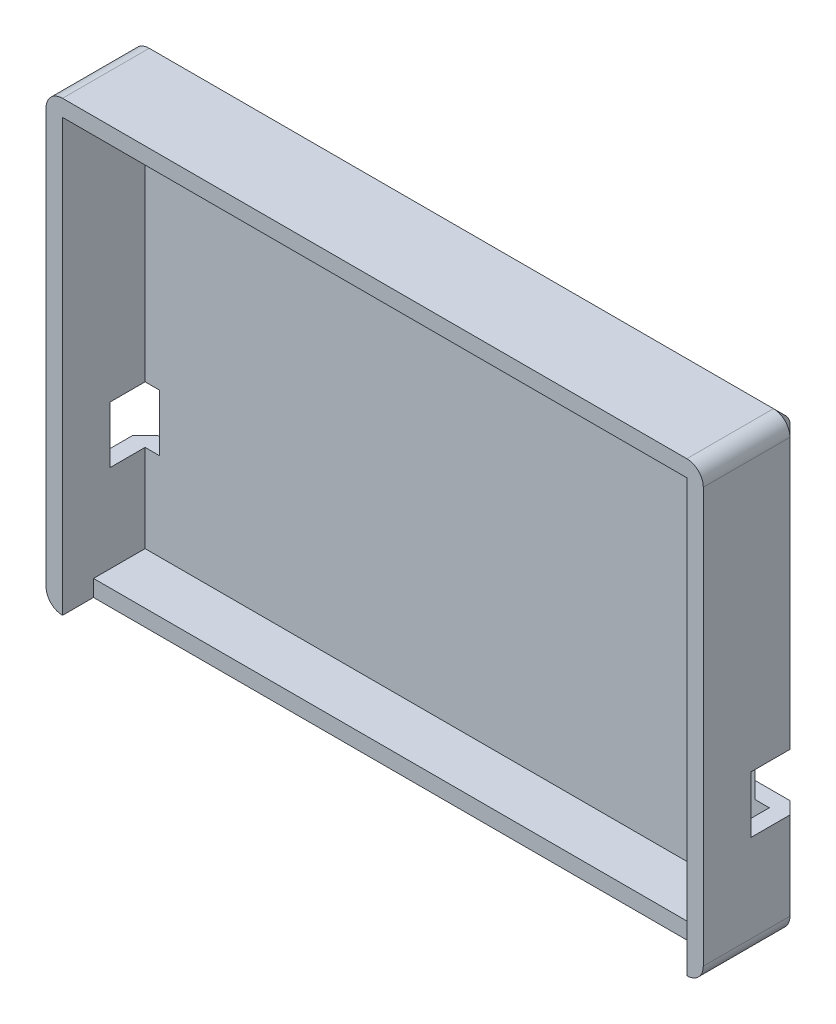
ISO-10303-21;
HEADER;
FILE_DESCRIPTION(('STEP AP214'),'2;1');
FILE_NAME('part.step','',(''),(''),'','','');
FILE_SCHEMA(('AUTOMOTIVE_DESIGN { 1 0 10303 214 1 1 1 1 }'));
ENDSEC;
DATA;
#1=APPLICATION_CONTEXT('core data for automotive mechanical design processes');
#2=APPLICATION_PROTOCOL_DEFINITION('international standard','automotive_design',2000,#1);
#3=PRODUCT_CONTEXT('',#1,'mechanical');
#4=PRODUCT('Part','Part','',(#3));
#5=PRODUCT_RELATED_PRODUCT_CATEGORY('part','',(#4));
#6=PRODUCT_DEFINITION_FORMATION('','',#4);
#7=PRODUCT_DEFINITION_CONTEXT('part definition',#1,'design');
#8=PRODUCT_DEFINITION('design','',#6,#7);
#9=PRODUCT_DEFINITION_SHAPE('','',#8);
#10=(LENGTH_UNIT() NAMED_UNIT(*) SI_UNIT(.MILLI.,.METRE.));
#11=(NAMED_UNIT(*) PLANE_ANGLE_UNIT() SI_UNIT($,.RADIAN.));
#12=(NAMED_UNIT(*) SI_UNIT($,.STERADIAN.) SOLID_ANGLE_UNIT());
#13=UNCERTAINTY_MEASURE_WITH_UNIT(LENGTH_MEASURE(1.E-05),#10,'distance_accuracy_value','');
#14=(GEOMETRIC_REPRESENTATION_CONTEXT(3) GLOBAL_UNCERTAINTY_ASSIGNED_CONTEXT((#13)) GLOBAL_UNIT_ASSIGNED_CONTEXT((#10,
#11,#12)) REPRESENTATION_CONTEXT('',''));
#15=CARTESIAN_POINT('',(0.,0.,0.));
#16=DIRECTION('',(0.,0.,1.));
#17=DIRECTION('',(1.,0.,0.));
#18=AXIS2_PLACEMENT_3D('',#15,#16,#17);
#19=CARTESIAN_POINT('',(-31.85,-21.7,1.6));
#20=DIRECTION('',(0.,1.,0.));
#21=DIRECTION('',(0.,0.,1.));
#22=AXIS2_PLACEMENT_3D('',#19,#20,#21);
#23=PLANE('',#22);
#24=DIRECTION('',(0.,0.,-1.));
#25=VECTOR('',#24,1.);
#26=CARTESIAN_POINT('',(-30.25,-21.7,1.6));
#27=LINE('',#26,#25);
#28=CARTESIAN_POINT('',(-30.25,-21.7,6.6));
#29=VERTEX_POINT('',#28);
#30=CARTESIAN_POINT('',(-30.25,-21.7,1.2));
#31=VERTEX_POINT('',#30);
#32=EDGE_CURVE('E413',#29,#31,#27,.T.);
#33=ORIENTED_EDGE('',*,*,#32,.T.);
#34=DIRECTION('',(1.,0.,0.));
#35=VECTOR('',#34,1.);
#36=CARTESIAN_POINT('',(-31.85,-21.7,1.2));
#37=LINE('',#36,#35);
#38=CARTESIAN_POINT('',(30.25,-21.7,1.2));
#39=VERTEX_POINT('',#38);
#40=EDGE_CURVE('E457',#31,#39,#37,.T.);
#41=ORIENTED_EDGE('',*,*,#40,.T.);
#42=DIRECTION('',(0.,0.,-1.));
#43=VECTOR('',#42,1.);
#44=CARTESIAN_POINT('',(30.25,-21.7,1.6));
#45=LINE('',#44,#43);
#46=CARTESIAN_POINT('',(30.25,-21.7,6.6));
#47=VERTEX_POINT('',#46);
#48=EDGE_CURVE('E411',#39,#47,#45,.F.);
#49=ORIENTED_EDGE('',*,*,#48,.T.);
#50=DIRECTION('',(-1.,0.,0.));
#51=VECTOR('',#50,1.);
#52=CARTESIAN_POINT('',(-30.25,-21.7,6.6));
#53=LINE('',#52,#51);
#54=EDGE_CURVE('E308',#47,#29,#53,.T.);
#55=ORIENTED_EDGE('',*,*,#54,.T.);
#56=EDGE_LOOP('',(#33,#41,#49,#55));
#57=FACE_BOUND('',#56,.T.);
#58=ADVANCED_FACE('F33',(#57),#23,.F.);
#59=CARTESIAN_POINT('',(31.85,-21.7,1.6));
#60=DIRECTION('',(-1.,0.,0.));
#61=DIRECTION('',(0.,0.,1.));
#62=AXIS2_PLACEMENT_3D('',#59,#60,#61);
#63=PLANE('',#62);
#64=DIRECTION('',(0.,0.,-1.));
#65=VECTOR('',#64,1.);
#66=CARTESIAN_POINT('',(31.85,-20.1,1.6));
#67=LINE('',#66,#65);
#68=CARTESIAN_POINT('',(31.85,-20.1,9.6));
#69=VERTEX_POINT('',#68);
#70=CARTESIAN_POINT('',(31.85,-20.1,1.2));
#71=VERTEX_POINT('',#70);
#72=EDGE_CURVE('E418',#69,#71,#67,.T.);
#73=ORIENTED_EDGE('',*,*,#72,.T.);
#74=DIRECTION('',(0.,1.,0.));
#75=VECTOR('',#74,1.);
#76=CARTESIAN_POINT('',(31.85,-21.7,1.2));
#77=LINE('',#76,#75);
#78=CARTESIAN_POINT('',(31.85,-11.6,1.2));
#79=VERTEX_POINT('',#78);
#80=EDGE_CURVE('E449',#71,#79,#77,.T.);
#81=ORIENTED_EDGE('',*,*,#80,.T.);
#82=DIRECTION('',(0.,0.,-1.));
#83=VECTOR('',#82,1.);
#84=CARTESIAN_POINT('',(31.85,-11.6,5.));
#85=LINE('',#84,#83);
#86=CARTESIAN_POINT('',(31.85,-11.6,5.));
#87=VERTEX_POINT('',#86);
#88=EDGE_CURVE('E259',#87,#79,#85,.T.);
#89=ORIENTED_EDGE('',*,*,#88,.F.);
#90=DIRECTION('',(0.,-1.,0.));
#91=VECTOR('',#90,1.);
#92=CARTESIAN_POINT('',(31.85,-6.1,5.));
#93=LINE('',#92,#91);
#94=CARTESIAN_POINT('',(31.85,-6.1,5.));
#95=VERTEX_POINT('',#94);
#96=EDGE_CURVE('E242',#95,#87,#93,.T.);
#97=ORIENTED_EDGE('',*,*,#96,.F.);
#98=DIRECTION('',(0.,0.,-1.));
#99=VECTOR('',#98,1.);
#100=CARTESIAN_POINT('',(31.85,-6.1,5.));
#101=LINE('',#100,#99);
#102=CARTESIAN_POINT('',(31.85,-6.1,1.2));
#103=VERTEX_POINT('',#102);
#104=EDGE_CURVE('E251',#95,#103,#101,.T.);
#105=ORIENTED_EDGE('',*,*,#104,.T.);
#106=DIRECTION('',(0.,1.,0.));
#107=VECTOR('',#106,1.);
#108=CARTESIAN_POINT('',(31.85,-21.7,1.2));
#109=LINE('',#108,#107);
#110=CARTESIAN_POINT('',(31.85,20.1,1.2));
#111=VERTEX_POINT('',#110);
#112=EDGE_CURVE('E447',#103,#111,#109,.T.);
#113=ORIENTED_EDGE('',*,*,#112,.T.);
#114=DIRECTION('',(0.,0.,-1.));
#115=VECTOR('',#114,1.);
#116=CARTESIAN_POINT('',(31.85,20.1,1.6));
#117=LINE('',#116,#115);
#118=CARTESIAN_POINT('',(31.85,20.1,9.6));
#119=VERTEX_POINT('',#118);
#120=EDGE_CURVE('E416',#111,#119,#117,.F.);
#121=ORIENTED_EDGE('',*,*,#120,.T.);
#122=DIRECTION('',(0.,1.,0.));
#123=VECTOR('',#122,1.);
#124=CARTESIAN_POINT('',(31.85,-21.7,9.6));
#125=LINE('',#124,#123);
#126=EDGE_CURVE('E352',#69,#119,#125,.T.);
#127=ORIENTED_EDGE('',*,*,#126,.F.);
#128=EDGE_LOOP('',(#73,#81,#89,#97,#105,#113,#121,#127));
#129=FACE_BOUND('',#128,.T.);
#130=ADVANCED_FACE('F264',(#129),#63,.F.);
#131=CARTESIAN_POINT('',(-31.85,21.7,1.6));
#132=DIRECTION('',(0.,-1.,0.));
#133=DIRECTION('',(1.,0.,0.));
#134=AXIS2_PLACEMENT_3D('',#131,#132,#133);
#135=PLANE('',#134);
#136=DIRECTION('',(0.,0.,-1.));
#137=VECTOR('',#136,1.);
#138=CARTESIAN_POINT('',(30.25,21.7,1.6));
#139=LINE('',#138,#137);
#140=CARTESIAN_POINT('',(30.25,21.7,9.6));
#141=VERTEX_POINT('',#140);
#142=CARTESIAN_POINT('',(30.25,21.7,1.2));
#143=VERTEX_POINT('',#142);
#144=EDGE_CURVE('E399',#141,#143,#139,.T.);
#145=ORIENTED_EDGE('',*,*,#144,.T.);
#146=DIRECTION('',(-1.,0.,0.));
#147=VECTOR('',#146,1.);
#148=CARTESIAN_POINT('',(-31.85,21.7,1.2));
#149=LINE('',#148,#147);
#150=CARTESIAN_POINT('',(-30.25,21.7,1.2));
#151=VERTEX_POINT('',#150);
#152=EDGE_CURVE('E11',#143,#151,#149,.T.);
#153=ORIENTED_EDGE('',*,*,#152,.T.);
#154=DIRECTION('',(0.,0.,-1.));
#155=VECTOR('',#154,1.);
#156=CARTESIAN_POINT('',(-30.25,21.7,1.6));
#157=LINE('',#156,#155);
#158=CARTESIAN_POINT('',(-30.25,21.7,9.6));
#159=VERTEX_POINT('',#158);
#160=EDGE_CURVE('E401',#151,#159,#157,.F.);
#161=ORIENTED_EDGE('',*,*,#160,.T.);
#162=DIRECTION('',(-1.,0.,0.));
#163=VECTOR('',#162,1.);
#164=CARTESIAN_POINT('',(31.85,21.7,9.6));
#165=LINE('',#164,#163);
#166=EDGE_CURVE('E355',#141,#159,#165,.T.);
#167=ORIENTED_EDGE('',*,*,#166,.F.);
#168=EDGE_LOOP('',(#145,#153,#161,#167));
#169=FACE_BOUND('',#168,.T.);
#170=ADVANCED_FACE('F599',(#169),#135,.F.);
#171=CARTESIAN_POINT('',(-31.85,-21.7,1.6));
#172=DIRECTION('',(1.,0.,0.));
#173=DIRECTION('',(0.,0.,-1.));
#174=AXIS2_PLACEMENT_3D('',#171,#172,#173);
#175=PLANE('',#174);
#176=DIRECTION('',(0.,0.,-1.));
#177=VECTOR('',#176,1.);
#178=CARTESIAN_POINT('',(-31.85,-11.6,5.));
#179=LINE('',#178,#177);
#180=CARTESIAN_POINT('',(-31.85,-11.6,5.));
#181=VERTEX_POINT('',#180);
#182=CARTESIAN_POINT('',(-31.85,-11.6,1.2));
#183=VERTEX_POINT('',#182);
#184=EDGE_CURVE('E284',#181,#183,#179,.T.);
#185=ORIENTED_EDGE('',*,*,#184,.T.);
#186=DIRECTION('',(0.,-1.,0.));
#187=VECTOR('',#186,1.);
#188=CARTESIAN_POINT('',(-31.85,-21.7,1.2));
#189=LINE('',#188,#187);
#190=CARTESIAN_POINT('',(-31.85,-20.1,1.2));
#191=VERTEX_POINT('',#190);
#192=EDGE_CURVE('E422',#183,#191,#189,.T.);
#193=ORIENTED_EDGE('',*,*,#192,.T.);
#194=DIRECTION('',(0.,0.,-1.));
#195=VECTOR('',#194,1.);
#196=CARTESIAN_POINT('',(-31.85,-20.1,1.6));
#197=LINE('',#196,#195);
#198=CARTESIAN_POINT('',(-31.85,-20.1,9.6));
#199=VERTEX_POINT('',#198);
#200=EDGE_CURVE('E394',#191,#199,#197,.F.);
#201=ORIENTED_EDGE('',*,*,#200,.T.);
#202=DIRECTION('',(0.,-1.,0.));
#203=VECTOR('',#202,1.);
#204=CARTESIAN_POINT('',(-31.85,-21.7,9.6));
#205=LINE('',#204,#203);
#206=CARTESIAN_POINT('',(-31.85,20.1,9.6));
#207=VERTEX_POINT('',#206);
#208=EDGE_CURVE('E349',#207,#199,#205,.T.);
#209=ORIENTED_EDGE('',*,*,#208,.F.);
#210=DIRECTION('',(0.,0.,-1.));
#211=VECTOR('',#210,1.);
#212=CARTESIAN_POINT('',(-31.85,20.1,1.6));
#213=LINE('',#212,#211);
#214=CARTESIAN_POINT('',(-31.85,20.1,1.2));
#215=VERTEX_POINT('',#214);
#216=EDGE_CURVE('E396',#207,#215,#213,.T.);
#217=ORIENTED_EDGE('',*,*,#216,.T.);
#218=DIRECTION('',(0.,-1.,0.));
#219=VECTOR('',#218,1.);
#220=CARTESIAN_POINT('',(-31.85,-21.7,1.2));
#221=LINE('',#220,#219);
#222=CARTESIAN_POINT('',(-31.85,-6.1,1.2));
#223=VERTEX_POINT('',#222);
#224=EDGE_CURVE('E420',#215,#223,#221,.T.);
#225=ORIENTED_EDGE('',*,*,#224,.T.);
#226=DIRECTION('',(0.,0.,-1.));
#227=VECTOR('',#226,1.);
#228=CARTESIAN_POINT('',(-31.85,-6.1,5.));
#229=LINE('',#228,#227);
#230=CARTESIAN_POINT('',(-31.85,-6.1,5.));
#231=VERTEX_POINT('',#230);
#232=EDGE_CURVE('E271',#231,#223,#229,.T.);
#233=ORIENTED_EDGE('',*,*,#232,.F.);
#234=DIRECTION('',(0.,1.,0.));
#235=VECTOR('',#234,1.);
#236=CARTESIAN_POINT('',(-31.85,-6.1,5.));
#237=LINE('',#236,#235);
#238=EDGE_CURVE('E281',#181,#231,#237,.T.);
#239=ORIENTED_EDGE('',*,*,#238,.F.);
#240=EDGE_LOOP('',(#185,#193,#201,#209,#217,#225,#233,#239));
#241=FACE_BOUND('',#240,.T.);
#242=ADVANCED_FACE('F495',(#241),#175,.F.);
#243=CARTESIAN_POINT('',(0.,0.,0.));
#244=DIRECTION('',(0.,0.,1.));
#245=DIRECTION('',(1.,0.,0.));
#246=AXIS2_PLACEMENT_3D('',#243,#244,#245);
#247=PLANE('',#246);
#248=CARTESIAN_POINT('',(-30.25,-20.1,0.));
#249=DIRECTION('',(0.,0.,1.));
#250=DIRECTION('',(1.,0.,0.));
#251=AXIS2_PLACEMENT_3D('',#248,#249,#250);
#252=CIRCLE('',#251,0.400000000000001);
#253=CARTESIAN_POINT('',(-30.25,-20.5,0.));
#254=VERTEX_POINT('',#253);
#255=CARTESIAN_POINT('',(-30.65,-20.1,0.));
#256=VERTEX_POINT('',#255);
#257=EDGE_CURVE('E439',#254,#256,#252,.F.);
#258=ORIENTED_EDGE('',*,*,#257,.T.);
#259=DIRECTION('',(0.,1.,0.));
#260=VECTOR('',#259,1.);
#261=CARTESIAN_POINT('',(-30.65,0.,0.));
#262=LINE('',#261,#260);
#263=CARTESIAN_POINT('',(-30.65,-11.6,0.));
#264=VERTEX_POINT('',#263);
#265=EDGE_CURVE('E443',#256,#264,#262,.T.);
#266=ORIENTED_EDGE('',*,*,#265,.T.);
#267=DIRECTION('',(-1.,0.,0.));
#268=VECTOR('',#267,1.);
#269=CARTESIAN_POINT('',(-31.85,-11.6,0.));
#270=LINE('',#269,#268);
#271=CARTESIAN_POINT('',(-27.25,-11.6,0.));
#272=VERTEX_POINT('',#271);
#273=EDGE_CURVE('E279',#272,#264,#270,.T.);
#274=ORIENTED_EDGE('',*,*,#273,.F.);
#275=DIRECTION('',(0.,1.,0.));
#276=VECTOR('',#275,1.);
#277=CARTESIAN_POINT('',(-27.25,0.,0.));
#278=LINE('',#277,#276);
#279=CARTESIAN_POINT('',(-27.25,-6.1,0.));
#280=VERTEX_POINT('',#279);
#281=EDGE_CURVE('E379',#272,#280,#278,.T.);
#282=ORIENTED_EDGE('',*,*,#281,.T.);
#283=DIRECTION('',(1.,0.,0.));
#284=VECTOR('',#283,1.);
#285=CARTESIAN_POINT('',(-31.85,-6.1,0.));
#286=LINE('',#285,#284);
#287=CARTESIAN_POINT('',(-30.65,-6.1,0.));
#288=VERTEX_POINT('',#287);
#289=EDGE_CURVE('E285',#288,#280,#286,.T.);
#290=ORIENTED_EDGE('',*,*,#289,.F.);
#291=DIRECTION('',(0.,1.,0.));
#292=VECTOR('',#291,1.);
#293=CARTESIAN_POINT('',(-30.65,0.,0.));
#294=LINE('',#293,#292);
#295=CARTESIAN_POINT('',(-30.65,20.1,0.));
#296=VERTEX_POINT('',#295);
#297=EDGE_CURVE('E431',#288,#296,#294,.T.);
#298=ORIENTED_EDGE('',*,*,#297,.T.);
#299=CARTESIAN_POINT('',(-30.25,20.1,0.));
#300=DIRECTION('',(0.,0.,1.));
#301=DIRECTION('',(1.,0.,0.));
#302=AXIS2_PLACEMENT_3D('',#299,#300,#301);
#303=CIRCLE('',#302,0.400000000000001);
#304=CARTESIAN_POINT('',(-30.25,20.5,0.));
#305=VERTEX_POINT('',#304);
#306=EDGE_CURVE('E427',#296,#305,#303,.F.);
#307=ORIENTED_EDGE('',*,*,#306,.T.);
#308=DIRECTION('',(1.,0.,0.));
#309=VECTOR('',#308,1.);
#310=CARTESIAN_POINT('',(0.,20.5,0.));
#311=LINE('',#310,#309);
#312=CARTESIAN_POINT('',(30.25,20.5,0.));
#313=VERTEX_POINT('',#312);
#314=EDGE_CURVE('E425',#305,#313,#311,.T.);
#315=ORIENTED_EDGE('',*,*,#314,.T.);
#316=CARTESIAN_POINT('',(30.25,20.1,0.));
#317=DIRECTION('',(0.,0.,1.));
#318=DIRECTION('',(1.,0.,0.));
#319=AXIS2_PLACEMENT_3D('',#316,#317,#318);
#320=CIRCLE('',#319,0.400000000000001);
#321=CARTESIAN_POINT('',(30.65,20.1,0.));
#322=VERTEX_POINT('',#321);
#323=EDGE_CURVE('E429',#313,#322,#320,.F.);
#324=ORIENTED_EDGE('',*,*,#323,.T.);
#325=DIRECTION('',(0.,-1.,0.));
#326=VECTOR('',#325,1.);
#327=CARTESIAN_POINT('',(30.65,0.,0.));
#328=LINE('',#327,#326);
#329=CARTESIAN_POINT('',(30.65,-6.1,0.));
#330=VERTEX_POINT('',#329);
#331=EDGE_CURVE('E433',#322,#330,#328,.T.);
#332=ORIENTED_EDGE('',*,*,#331,.T.);
#333=DIRECTION('',(1.,0.,0.));
#334=VECTOR('',#333,1.);
#335=CARTESIAN_POINT('',(31.85,-6.1,0.));
#336=LINE('',#335,#334);
#337=CARTESIAN_POINT('',(27.25,-6.1,0.));
#338=VERTEX_POINT('',#337);
#339=EDGE_CURVE('E269',#338,#330,#336,.T.);
#340=ORIENTED_EDGE('',*,*,#339,.F.);
#341=DIRECTION('',(0.,-1.,0.));
#342=VECTOR('',#341,1.);
#343=CARTESIAN_POINT('',(27.25,0.,0.));
#344=LINE('',#343,#342);
#345=CARTESIAN_POINT('',(27.25,-11.6,0.));
#346=VERTEX_POINT('',#345);
#347=EDGE_CURVE('E376',#338,#346,#344,.T.);
#348=ORIENTED_EDGE('',*,*,#347,.T.);
#349=DIRECTION('',(-1.,0.,0.));
#350=VECTOR('',#349,1.);
#351=CARTESIAN_POINT('',(31.85,-11.6,0.));
#352=LINE('',#351,#350);
#353=CARTESIAN_POINT('',(30.65,-11.6,0.));
#354=VERTEX_POINT('',#353);
#355=EDGE_CURVE('E248',#354,#346,#352,.T.);
#356=ORIENTED_EDGE('',*,*,#355,.F.);
#357=DIRECTION('',(0.,-1.,0.));
#358=VECTOR('',#357,1.);
#359=CARTESIAN_POINT('',(30.65,0.,0.));
#360=LINE('',#359,#358);
#361=CARTESIAN_POINT('',(30.65,-20.1,0.));
#362=VERTEX_POINT('',#361);
#363=EDGE_CURVE('E441',#354,#362,#360,.T.);
#364=ORIENTED_EDGE('',*,*,#363,.T.);
#365=CARTESIAN_POINT('',(30.25,-20.1,0.));
#366=DIRECTION('',(0.,0.,1.));
#367=DIRECTION('',(1.,0.,0.));
#368=AXIS2_PLACEMENT_3D('',#365,#366,#367);
#369=CIRCLE('',#368,0.400000000000001);
#370=CARTESIAN_POINT('',(30.25,-20.5,0.));
#371=VERTEX_POINT('',#370);
#372=EDGE_CURVE('E437',#362,#371,#369,.F.);
#373=ORIENTED_EDGE('',*,*,#372,.T.);
#374=DIRECTION('',(-1.,0.,0.));
#375=VECTOR('',#374,1.);
#376=CARTESIAN_POINT('',(0.,-20.5,0.));
#377=LINE('',#376,#375);
#378=EDGE_CURVE('E435',#371,#254,#377,.T.);
#379=ORIENTED_EDGE('',*,*,#378,.T.);
#380=EDGE_LOOP('',(#258,#266,#274,#282,#290,#298,#307,#315,#324,#332,#340,#348,#356,#364,#373,#379));
#381=FACE_BOUND('',#380,.T.);
#382=ADVANCED_FACE('F552',(#381),#247,.F.);
#383=CARTESIAN_POINT('',(0.,0.,9.6));
#384=DIRECTION('',(0.,0.,1.));
#385=DIRECTION('',(1.,0.,0.));
#386=AXIS2_PLACEMENT_3D('',#383,#384,#385);
#387=PLANE('',#386);
#388=ORIENTED_EDGE('',*,*,#166,.T.);
#389=CARTESIAN_POINT('',(-30.25,20.1,9.6));
#390=DIRECTION('',(0.,0.,1.));
#391=DIRECTION('',(1.,0.,0.));
#392=AXIS2_PLACEMENT_3D('',#389,#390,#391);
#393=CIRCLE('',#392,1.6);
#394=EDGE_CURVE('E409',#159,#207,#393,.T.);
#395=ORIENTED_EDGE('',*,*,#394,.T.);
#396=ORIENTED_EDGE('',*,*,#208,.T.);
#397=CARTESIAN_POINT('',(-30.25,-20.1,9.6));
#398=DIRECTION('',(0.,0.,1.));
#399=DIRECTION('',(1.,0.,0.));
#400=AXIS2_PLACEMENT_3D('',#397,#398,#399);
#401=CIRCLE('',#400,1.6);
#402=CARTESIAN_POINT('',(-30.25,-21.7,9.6));
#403=VERTEX_POINT('',#402);
#404=EDGE_CURVE('E407',#199,#403,#401,.T.);
#405=ORIENTED_EDGE('',*,*,#404,.T.);
#406=DIRECTION('',(0.,-1.,0.));
#407=VECTOR('',#406,1.);
#408=CARTESIAN_POINT('',(-30.25,-20.1,9.6));
#409=LINE('',#408,#407);
#410=CARTESIAN_POINT('',(-30.25,20.1,9.6));
#411=VERTEX_POINT('',#410);
#412=EDGE_CURVE('E318',#411,#403,#409,.T.);
#413=ORIENTED_EDGE('',*,*,#412,.F.);
#414=DIRECTION('',(-1.,0.,0.));
#415=VECTOR('',#414,1.);
#416=CARTESIAN_POINT('',(30.25,20.1,9.6));
#417=LINE('',#416,#415);
#418=CARTESIAN_POINT('',(30.25,20.1,9.6));
#419=VERTEX_POINT('',#418);
#420=EDGE_CURVE('E325',#419,#411,#417,.T.);
#421=ORIENTED_EDGE('',*,*,#420,.F.);
#422=DIRECTION('',(0.,1.,0.));
#423=VECTOR('',#422,1.);
#424=CARTESIAN_POINT('',(30.25,-20.1,9.6));
#425=LINE('',#424,#423);
#426=CARTESIAN_POINT('',(30.25,-21.7,9.6));
#427=VERTEX_POINT('',#426);
#428=EDGE_CURVE('E321',#427,#419,#425,.T.);
#429=ORIENTED_EDGE('',*,*,#428,.F.);
#430=CARTESIAN_POINT('',(30.25,-20.1,9.6));
#431=DIRECTION('',(0.,0.,1.));
#432=DIRECTION('',(1.,0.,0.));
#433=AXIS2_PLACEMENT_3D('',#430,#431,#432);
#434=CIRCLE('',#433,1.6);
#435=EDGE_CURVE('E405',#427,#69,#434,.T.);
#436=ORIENTED_EDGE('',*,*,#435,.T.);
#437=ORIENTED_EDGE('',*,*,#126,.T.);
#438=CARTESIAN_POINT('',(30.25,20.1,9.6));
#439=DIRECTION('',(0.,0.,1.));
#440=DIRECTION('',(1.,0.,0.));
#441=AXIS2_PLACEMENT_3D('',#438,#439,#440);
#442=CIRCLE('',#441,1.6);
#443=EDGE_CURVE('E403',#119,#141,#442,.T.);
#444=ORIENTED_EDGE('',*,*,#443,.T.);
#445=EDGE_LOOP('',(#388,#395,#396,#405,#413,#421,#429,#436,#437,#444));
#446=FACE_BOUND('',#445,.T.);
#447=ADVANCED_FACE('F578',(#446),#387,.T.);
#448=CARTESIAN_POINT('',(-30.25,-20.1,9.6));
#449=DIRECTION('',(1.,0.,0.));
#450=DIRECTION('',(0.,1.,0.));
#451=AXIS2_PLACEMENT_3D('',#448,#449,#450);
#452=PLANE('',#451);
#453=DIRECTION('',(0.,0.,1.));
#454=VECTOR('',#453,1.);
#455=CARTESIAN_POINT('',(-30.25,-6.1,9.6));
#456=LINE('',#455,#454);
#457=CARTESIAN_POINT('',(-30.25,-6.1,1.6));
#458=VERTEX_POINT('',#457);
#459=CARTESIAN_POINT('',(-30.25,-6.1,5.));
#460=VERTEX_POINT('',#459);
#461=EDGE_CURVE('E295',#458,#460,#456,.T.);
#462=ORIENTED_EDGE('',*,*,#461,.F.);
#463=DIRECTION('',(0.,-1.,0.));
#464=VECTOR('',#463,1.);
#465=CARTESIAN_POINT('',(-30.25,-20.1,1.6));
#466=LINE('',#465,#464);
#467=CARTESIAN_POINT('',(-30.25,20.1,1.6));
#468=VERTEX_POINT('',#467);
#469=EDGE_CURVE('E328',#468,#458,#466,.T.);
#470=ORIENTED_EDGE('',*,*,#469,.F.);
#471=DIRECTION('',(0.,0.,-1.));
#472=VECTOR('',#471,1.);
#473=CARTESIAN_POINT('',(-30.25,20.1,9.6));
#474=LINE('',#473,#472);
#475=EDGE_CURVE('E327',#411,#468,#474,.T.);
#476=ORIENTED_EDGE('',*,*,#475,.F.);
#477=ORIENTED_EDGE('',*,*,#412,.T.);
#478=DIRECTION('',(0.,0.,1.));
#479=VECTOR('',#478,1.);
#480=CARTESIAN_POINT('',(-30.25,-21.7,6.6));
#481=LINE('',#480,#479);
#482=EDGE_CURVE('E302',#29,#403,#481,.T.);
#483=ORIENTED_EDGE('',*,*,#482,.F.);
#484=DIRECTION('',(0.,1.,0.));
#485=VECTOR('',#484,1.);
#486=CARTESIAN_POINT('',(-30.25,-21.7,6.6));
#487=LINE('',#486,#485);
#488=CARTESIAN_POINT('',(-30.25,-20.1,6.6));
#489=VERTEX_POINT('',#488);
#490=EDGE_CURVE('E314',#29,#489,#487,.T.);
#491=ORIENTED_EDGE('',*,*,#490,.T.);
#492=DIRECTION('',(0.,0.,-1.));
#493=VECTOR('',#492,1.);
#494=CARTESIAN_POINT('',(-30.25,-20.1,9.6));
#495=LINE('',#494,#493);
#496=CARTESIAN_POINT('',(-30.25,-20.1,1.6));
#497=VERTEX_POINT('',#496);
#498=EDGE_CURVE('E346',#489,#497,#495,.T.);
#499=ORIENTED_EDGE('',*,*,#498,.T.);
#500=CARTESIAN_POINT('',(-30.25,-11.6,1.6));
#501=VERTEX_POINT('',#500);
#502=EDGE_CURVE('E316',#501,#497,#466,.T.);
#503=ORIENTED_EDGE('',*,*,#502,.F.);
#504=DIRECTION('',(0.,0.,-1.));
#505=VECTOR('',#504,1.);
#506=CARTESIAN_POINT('',(-30.25,-11.6,9.6));
#507=LINE('',#506,#505);
#508=CARTESIAN_POINT('',(-30.25,-11.6,5.));
#509=VERTEX_POINT('',#508);
#510=EDGE_CURVE('E273',#509,#501,#507,.T.);
#511=ORIENTED_EDGE('',*,*,#510,.F.);
#512=DIRECTION('',(0.,1.,0.));
#513=VECTOR('',#512,1.);
#514=CARTESIAN_POINT('',(-30.25,-20.1,5.));
#515=LINE('',#514,#513);
#516=EDGE_CURVE('E367',#509,#460,#515,.T.);
#517=ORIENTED_EDGE('',*,*,#516,.T.);
#518=EDGE_LOOP('',(#462,#470,#476,#477,#483,#491,#499,#503,#511,#517));
#519=FACE_BOUND('',#518,.T.);
#520=ADVANCED_FACE('F590',(#519),#452,.T.);
#521=CARTESIAN_POINT('',(30.25,-20.1,9.6));
#522=DIRECTION('',(0.,1.,0.));
#523=DIRECTION('',(-1.,0.,0.));
#524=AXIS2_PLACEMENT_3D('',#521,#522,#523);
#525=PLANE('',#524);
#526=DIRECTION('',(-1.,0.,0.));
#527=VECTOR('',#526,1.);
#528=CARTESIAN_POINT('',(-30.25,-20.1,6.6));
#529=LINE('',#528,#527);
#530=CARTESIAN_POINT('',(30.25,-20.1,6.6));
#531=VERTEX_POINT('',#530);
#532=EDGE_CURVE('E301',#531,#489,#529,.T.);
#533=ORIENTED_EDGE('',*,*,#532,.F.);
#534=DIRECTION('',(0.,0.,-1.));
#535=VECTOR('',#534,1.);
#536=CARTESIAN_POINT('',(30.25,-20.1,9.6));
#537=LINE('',#536,#535);
#538=CARTESIAN_POINT('',(30.25,-20.1,1.6));
#539=VERTEX_POINT('',#538);
#540=EDGE_CURVE('E344',#531,#539,#537,.T.);
#541=ORIENTED_EDGE('',*,*,#540,.T.);
#542=DIRECTION('',(1.,0.,0.));
#543=VECTOR('',#542,1.);
#544=CARTESIAN_POINT('',(30.25,-20.1,1.6));
#545=LINE('',#544,#543);
#546=EDGE_CURVE('E331',#497,#539,#545,.T.);
#547=ORIENTED_EDGE('',*,*,#546,.F.);
#548=ORIENTED_EDGE('',*,*,#498,.F.);
#549=EDGE_LOOP('',(#533,#541,#547,#548));
#550=FACE_BOUND('',#549,.T.);
#551=ADVANCED_FACE('F571',(#550),#525,.T.);
#552=CARTESIAN_POINT('',(30.25,-20.1,9.6));
#553=DIRECTION('',(-1.,0.,0.));
#554=DIRECTION('',(0.,-1.,0.));
#555=AXIS2_PLACEMENT_3D('',#552,#553,#554);
#556=PLANE('',#555);
#557=DIRECTION('',(0.,0.,1.));
#558=VECTOR('',#557,1.);
#559=CARTESIAN_POINT('',(30.25,-11.6,9.6));
#560=LINE('',#559,#558);
#561=CARTESIAN_POINT('',(30.25,-11.6,1.6));
#562=VERTEX_POINT('',#561);
#563=CARTESIAN_POINT('',(30.25,-11.6,5.));
#564=VERTEX_POINT('',#563);
#565=EDGE_CURVE('E299',#562,#564,#560,.T.);
#566=ORIENTED_EDGE('',*,*,#565,.F.);
#567=DIRECTION('',(0.,1.,0.));
#568=VECTOR('',#567,1.);
#569=CARTESIAN_POINT('',(30.25,-20.1,1.6));
#570=LINE('',#569,#568);
#571=EDGE_CURVE('E335',#539,#562,#570,.T.);
#572=ORIENTED_EDGE('',*,*,#571,.F.);
#573=ORIENTED_EDGE('',*,*,#540,.F.);
#574=DIRECTION('',(0.,1.,0.));
#575=VECTOR('',#574,1.);
#576=CARTESIAN_POINT('',(30.25,-21.7,6.6));
#577=LINE('',#576,#575);
#578=EDGE_CURVE('E311',#47,#531,#577,.T.);
#579=ORIENTED_EDGE('',*,*,#578,.F.);
#580=DIRECTION('',(0.,0.,-1.));
#581=VECTOR('',#580,1.);
#582=CARTESIAN_POINT('',(30.25,-21.7,6.6));
#583=LINE('',#582,#581);
#584=EDGE_CURVE('E305',#427,#47,#583,.T.);
#585=ORIENTED_EDGE('',*,*,#584,.F.);
#586=ORIENTED_EDGE('',*,*,#428,.T.);
#587=DIRECTION('',(0.,0.,-1.));
#588=VECTOR('',#587,1.);
#589=CARTESIAN_POINT('',(30.25,20.1,9.6));
#590=LINE('',#589,#588);
#591=CARTESIAN_POINT('',(30.25,20.1,1.6));
#592=VERTEX_POINT('',#591);
#593=EDGE_CURVE('E341',#419,#592,#590,.T.);
#594=ORIENTED_EDGE('',*,*,#593,.T.);
#595=CARTESIAN_POINT('',(30.25,-6.1,1.6));
#596=VERTEX_POINT('',#595);
#597=EDGE_CURVE('E334',#596,#592,#570,.T.);
#598=ORIENTED_EDGE('',*,*,#597,.F.);
#599=DIRECTION('',(0.,0.,-1.));
#600=VECTOR('',#599,1.);
#601=CARTESIAN_POINT('',(30.25,-6.1,9.6));
#602=LINE('',#601,#600);
#603=CARTESIAN_POINT('',(30.25,-6.1,5.));
#604=VERTEX_POINT('',#603);
#605=EDGE_CURVE('E297',#604,#596,#602,.T.);
#606=ORIENTED_EDGE('',*,*,#605,.F.);
#607=DIRECTION('',(0.,-1.,0.));
#608=VECTOR('',#607,1.);
#609=CARTESIAN_POINT('',(30.25,-20.1,5.));
#610=LINE('',#609,#608);
#611=EDGE_CURVE('E245',#604,#564,#610,.T.);
#612=ORIENTED_EDGE('',*,*,#611,.T.);
#613=EDGE_LOOP('',(#566,#572,#573,#579,#585,#586,#594,#598,#606,#612));
#614=FACE_BOUND('',#613,.T.);
#615=ADVANCED_FACE('F562',(#614),#556,.T.);
#616=CARTESIAN_POINT('',(30.25,20.1,9.6));
#617=DIRECTION('',(0.,-1.,0.));
#618=DIRECTION('',(1.,0.,0.));
#619=AXIS2_PLACEMENT_3D('',#616,#617,#618);
#620=PLANE('',#619);
#621=DIRECTION('',(-1.,0.,0.));
#622=VECTOR('',#621,1.);
#623=CARTESIAN_POINT('',(30.25,20.1,1.6));
#624=LINE('',#623,#622);
#625=EDGE_CURVE('E322',#592,#468,#624,.T.);
#626=ORIENTED_EDGE('',*,*,#625,.F.);
#627=ORIENTED_EDGE('',*,*,#593,.F.);
#628=ORIENTED_EDGE('',*,*,#420,.T.);
#629=ORIENTED_EDGE('',*,*,#475,.T.);
#630=EDGE_LOOP('',(#626,#627,#628,#629));
#631=FACE_BOUND('',#630,.T.);
#632=ADVANCED_FACE('F585',(#631),#620,.T.);
#633=CARTESIAN_POINT('',(0.,0.,1.6));
#634=DIRECTION('',(0.,0.,1.));
#635=DIRECTION('',(1.,0.,0.));
#636=AXIS2_PLACEMENT_3D('',#633,#634,#635);
#637=PLANE('',#636);
#638=DIRECTION('',(0.,1.,0.));
#639=VECTOR('',#638,1.);
#640=CARTESIAN_POINT('',(-28.85,0.,1.6));
#641=LINE('',#640,#639);
#642=CARTESIAN_POINT('',(-28.85,-6.1,1.6));
#643=VERTEX_POINT('',#642);
#644=CARTESIAN_POINT('',(-28.85,-11.6,1.6));
#645=VERTEX_POINT('',#644);
#646=EDGE_CURVE('E373',#643,#645,#641,.F.);
#647=ORIENTED_EDGE('',*,*,#646,.T.);
#648=DIRECTION('',(1.,0.,0.));
#649=VECTOR('',#648,1.);
#650=CARTESIAN_POINT('',(0.,-11.6,1.6));
#651=LINE('',#650,#649);
#652=EDGE_CURVE('E358',#501,#645,#651,.T.);
#653=ORIENTED_EDGE('',*,*,#652,.F.);
#654=ORIENTED_EDGE('',*,*,#502,.T.);
#655=ORIENTED_EDGE('',*,*,#546,.T.);
#656=ORIENTED_EDGE('',*,*,#571,.T.);
#657=DIRECTION('',(1.,0.,0.));
#658=VECTOR('',#657,1.);
#659=CARTESIAN_POINT('',(0.,-11.6,1.6));
#660=LINE('',#659,#658);
#661=CARTESIAN_POINT('',(28.85,-11.6,1.6));
#662=VERTEX_POINT('',#661);
#663=EDGE_CURVE('E364',#662,#562,#660,.T.);
#664=ORIENTED_EDGE('',*,*,#663,.F.);
#665=DIRECTION('',(0.,-1.,0.));
#666=VECTOR('',#665,1.);
#667=CARTESIAN_POINT('',(28.85,0.,1.6));
#668=LINE('',#667,#666);
#669=CARTESIAN_POINT('',(28.85,-6.1,1.6));
#670=VERTEX_POINT('',#669);
#671=EDGE_CURVE('E370',#662,#670,#668,.F.);
#672=ORIENTED_EDGE('',*,*,#671,.T.);
#673=DIRECTION('',(-1.,0.,0.));
#674=VECTOR('',#673,1.);
#675=CARTESIAN_POINT('',(0.,-6.1,1.6));
#676=LINE('',#675,#674);
#677=EDGE_CURVE('E362',#596,#670,#676,.T.);
#678=ORIENTED_EDGE('',*,*,#677,.F.);
#679=ORIENTED_EDGE('',*,*,#597,.T.);
#680=ORIENTED_EDGE('',*,*,#625,.T.);
#681=ORIENTED_EDGE('',*,*,#469,.T.);
#682=DIRECTION('',(-1.,0.,0.));
#683=VECTOR('',#682,1.);
#684=CARTESIAN_POINT('',(0.,-6.1,1.6));
#685=LINE('',#684,#683);
#686=EDGE_CURVE('E360',#643,#458,#685,.T.);
#687=ORIENTED_EDGE('',*,*,#686,.F.);
#688=EDGE_LOOP('',(#647,#653,#654,#655,#656,#664,#672,#678,#679,#680,#681,#687));
#689=FACE_BOUND('',#688,.T.);
#690=ADVANCED_FACE('F564',(#689),#637,.T.);
#691=CARTESIAN_POINT('',(-30.25,-21.7,6.6));
#692=DIRECTION('',(0.,0.,-1.));
#693=DIRECTION('',(-1.,0.,0.));
#694=AXIS2_PLACEMENT_3D('',#691,#692,#693);
#695=PLANE('',#694);
#696=ORIENTED_EDGE('',*,*,#532,.T.);
#697=ORIENTED_EDGE('',*,*,#490,.F.);
#698=ORIENTED_EDGE('',*,*,#54,.F.);
#699=ORIENTED_EDGE('',*,*,#578,.T.);
#700=EDGE_LOOP('',(#696,#697,#698,#699));
#701=FACE_BOUND('',#700,.T.);
#702=ADVANCED_FACE('F575',(#701),#695,.F.);
#703=CARTESIAN_POINT('',(-31.85,-6.1,5.));
#704=DIRECTION('',(0.,1.,0.));
#705=DIRECTION('',(0.,0.,1.));
#706=AXIS2_PLACEMENT_3D('',#703,#704,#705);
#707=PLANE('',#706);
#708=ORIENTED_EDGE('',*,*,#232,.T.);
#709=DIRECTION('',(-0.707106781186548,0.,0.707106781186548));
#710=VECTOR('',#709,1.);
#711=CARTESIAN_POINT('',(-31.85,-6.1,1.2));
#712=LINE('',#711,#710);
#713=EDGE_CURVE('E460',#223,#288,#712,.F.);
#714=ORIENTED_EDGE('',*,*,#713,.T.);
#715=ORIENTED_EDGE('',*,*,#289,.T.);
#716=DIRECTION('',(0.707106781186544,0.,-0.707106781186551));
#717=VECTOR('',#716,1.);
#718=CARTESIAN_POINT('',(-32.05,-6.1,4.80000000000003));
#719=LINE('',#718,#717);
#720=EDGE_CURVE('E385',#280,#643,#719,.F.);
#721=ORIENTED_EDGE('',*,*,#720,.T.);
#722=ORIENTED_EDGE('',*,*,#686,.T.);
#723=ORIENTED_EDGE('',*,*,#461,.T.);
#724=DIRECTION('',(1.,0.,0.));
#725=VECTOR('',#724,1.);
#726=CARTESIAN_POINT('',(-31.85,-6.1,5.));
#727=LINE('',#726,#725);
#728=EDGE_CURVE('E275',#231,#460,#727,.T.);
#729=ORIENTED_EDGE('',*,*,#728,.F.);
#730=EDGE_LOOP('',(#708,#714,#715,#721,#722,#723,#729));
#731=FACE_BOUND('',#730,.T.);
#732=ADVANCED_FACE('F500',(#731),#707,.F.);
#733=CARTESIAN_POINT('',(-31.85,-11.6,5.));
#734=DIRECTION('',(0.,-1.,0.));
#735=DIRECTION('',(0.,0.,-1.));
#736=AXIS2_PLACEMENT_3D('',#733,#734,#735);
#737=PLANE('',#736);
#738=ORIENTED_EDGE('',*,*,#273,.T.);
#739=DIRECTION('',(0.707106781186548,0.,-0.707106781186548));
#740=VECTOR('',#739,1.);
#741=CARTESIAN_POINT('',(-31.85,-11.6,1.2));
#742=LINE('',#741,#740);
#743=EDGE_CURVE('E445',#264,#183,#742,.F.);
#744=ORIENTED_EDGE('',*,*,#743,.T.);
#745=ORIENTED_EDGE('',*,*,#184,.F.);
#746=DIRECTION('',(-1.,0.,0.));
#747=VECTOR('',#746,1.);
#748=CARTESIAN_POINT('',(-31.85,-11.6,5.));
#749=LINE('',#748,#747);
#750=EDGE_CURVE('E278',#509,#181,#749,.T.);
#751=ORIENTED_EDGE('',*,*,#750,.F.);
#752=ORIENTED_EDGE('',*,*,#510,.T.);
#753=ORIENTED_EDGE('',*,*,#652,.T.);
#754=DIRECTION('',(-0.707106781186544,0.,0.707106781186551));
#755=VECTOR('',#754,1.);
#756=CARTESIAN_POINT('',(-32.05,-11.6,4.80000000000003));
#757=LINE('',#756,#755);
#758=EDGE_CURVE('E382',#645,#272,#757,.F.);
#759=ORIENTED_EDGE('',*,*,#758,.T.);
#760=EDGE_LOOP('',(#738,#744,#745,#751,#752,#753,#759));
#761=FACE_BOUND('',#760,.T.);
#762=ADVANCED_FACE('F592',(#761),#737,.F.);
#763=CARTESIAN_POINT('',(0.,0.,5.));
#764=DIRECTION('',(0.,0.,-1.));
#765=DIRECTION('',(-1.,0.,0.));
#766=AXIS2_PLACEMENT_3D('',#763,#764,#765);
#767=PLANE('',#766);
#768=ORIENTED_EDGE('',*,*,#750,.T.);
#769=ORIENTED_EDGE('',*,*,#238,.T.);
#770=ORIENTED_EDGE('',*,*,#728,.T.);
#771=ORIENTED_EDGE('',*,*,#516,.F.);
#772=EDGE_LOOP('',(#768,#769,#770,#771));
#773=FACE_BOUND('',#772,.T.);
#774=ADVANCED_FACE('F504',(#773),#767,.T.);
#775=CARTESIAN_POINT('',(31.85,-11.6,5.));
#776=DIRECTION('',(0.,-1.,0.));
#777=DIRECTION('',(0.,0.,-1.));
#778=AXIS2_PLACEMENT_3D('',#775,#776,#777);
#779=PLANE('',#778);
#780=ORIENTED_EDGE('',*,*,#88,.T.);
#781=DIRECTION('',(0.707106781186548,0.,0.707106781186548));
#782=VECTOR('',#781,1.);
#783=CARTESIAN_POINT('',(31.85,-11.6,1.2));
#784=LINE('',#783,#782);
#785=EDGE_CURVE('E451',#79,#354,#784,.F.);
#786=ORIENTED_EDGE('',*,*,#785,.T.);
#787=ORIENTED_EDGE('',*,*,#355,.T.);
#788=DIRECTION('',(-0.707106781186544,0.,-0.707106781186551));
#789=VECTOR('',#788,1.);
#790=CARTESIAN_POINT('',(32.05,-11.6,4.80000000000003));
#791=LINE('',#790,#789);
#792=EDGE_CURVE('E391',#346,#662,#791,.F.);
#793=ORIENTED_EDGE('',*,*,#792,.T.);
#794=ORIENTED_EDGE('',*,*,#663,.T.);
#795=ORIENTED_EDGE('',*,*,#565,.T.);
#796=DIRECTION('',(-1.,0.,0.));
#797=VECTOR('',#796,1.);
#798=CARTESIAN_POINT('',(31.85,-11.6,5.));
#799=LINE('',#798,#797);
#800=EDGE_CURVE('E260',#87,#564,#799,.T.);
#801=ORIENTED_EDGE('',*,*,#800,.F.);
#802=EDGE_LOOP('',(#780,#786,#787,#793,#794,#795,#801));
#803=FACE_BOUND('',#802,.T.);
#804=ADVANCED_FACE('F549',(#803),#779,.F.);
#805=CARTESIAN_POINT('',(31.85,-6.1,5.));
#806=DIRECTION('',(0.,1.,0.));
#807=DIRECTION('',(0.,0.,1.));
#808=AXIS2_PLACEMENT_3D('',#805,#806,#807);
#809=PLANE('',#808);
#810=ORIENTED_EDGE('',*,*,#339,.T.);
#811=DIRECTION('',(-0.707106781186548,0.,-0.707106781186548));
#812=VECTOR('',#811,1.);
#813=CARTESIAN_POINT('',(31.85,-6.1,1.2));
#814=LINE('',#813,#812);
#815=EDGE_CURVE('E255',#330,#103,#814,.F.);
#816=ORIENTED_EDGE('',*,*,#815,.T.);
#817=ORIENTED_EDGE('',*,*,#104,.F.);
#818=DIRECTION('',(1.,0.,0.));
#819=VECTOR('',#818,1.);
#820=CARTESIAN_POINT('',(31.85,-6.1,5.));
#821=LINE('',#820,#819);
#822=EDGE_CURVE('E237',#604,#95,#821,.T.);
#823=ORIENTED_EDGE('',*,*,#822,.F.);
#824=ORIENTED_EDGE('',*,*,#605,.T.);
#825=ORIENTED_EDGE('',*,*,#677,.T.);
#826=DIRECTION('',(0.707106781186544,0.,0.707106781186551));
#827=VECTOR('',#826,1.);
#828=CARTESIAN_POINT('',(32.05,-6.1,4.80000000000003));
#829=LINE('',#828,#827);
#830=EDGE_CURVE('E388',#670,#338,#829,.F.);
#831=ORIENTED_EDGE('',*,*,#830,.T.);
#832=EDGE_LOOP('',(#810,#816,#817,#823,#824,#825,#831));
#833=FACE_BOUND('',#832,.T.);
#834=ADVANCED_FACE('F253',(#833),#809,.F.);
#835=CARTESIAN_POINT('',(0.,0.,5.));
#836=DIRECTION('',(0.,0.,-1.));
#837=DIRECTION('',(-1.,0.,0.));
#838=AXIS2_PLACEMENT_3D('',#835,#836,#837);
#839=PLANE('',#838);
#840=ORIENTED_EDGE('',*,*,#822,.T.);
#841=ORIENTED_EDGE('',*,*,#96,.T.);
#842=ORIENTED_EDGE('',*,*,#800,.T.);
#843=ORIENTED_EDGE('',*,*,#611,.F.);
#844=EDGE_LOOP('',(#840,#841,#842,#843));
#845=FACE_BOUND('',#844,.T.);
#846=ADVANCED_FACE('F239',(#845),#839,.T.);
#847=CARTESIAN_POINT('',(-29.25,-6.1,2.00000000000004));
#848=DIRECTION('',(0.707106781186551,0.,0.707106781186544));
#849=DIRECTION('',(0.,-1.,0.));
#850=AXIS2_PLACEMENT_3D('',#847,#848,#849);
#851=PLANE('',#850);
#852=ORIENTED_EDGE('',*,*,#720,.F.);
#853=ORIENTED_EDGE('',*,*,#281,.F.);
#854=ORIENTED_EDGE('',*,*,#758,.F.);
#855=ORIENTED_EDGE('',*,*,#646,.F.);
#856=EDGE_LOOP('',(#852,#853,#854,#855));
#857=FACE_BOUND('',#856,.T.);
#858=ADVANCED_FACE('F625',(#857),#851,.F.);
#859=CARTESIAN_POINT('',(29.25,-6.1,2.00000000000004));
#860=DIRECTION('',(-0.707106781186551,0.,0.707106781186544));
#861=DIRECTION('',(0.,1.,0.));
#862=AXIS2_PLACEMENT_3D('',#859,#860,#861);
#863=PLANE('',#862);
#864=ORIENTED_EDGE('',*,*,#792,.F.);
#865=ORIENTED_EDGE('',*,*,#347,.F.);
#866=ORIENTED_EDGE('',*,*,#830,.F.);
#867=ORIENTED_EDGE('',*,*,#671,.F.);
#868=EDGE_LOOP('',(#864,#865,#866,#867));
#869=FACE_BOUND('',#868,.T.);
#870=ADVANCED_FACE('F556',(#869),#863,.F.);
#871=CARTESIAN_POINT('',(-30.25,20.1,1.6));
#872=DIRECTION('',(0.,0.,-1.));
#873=DIRECTION('',(-1.,0.,0.));
#874=AXIS2_PLACEMENT_3D('',#871,#872,#873);
#875=CYLINDRICAL_SURFACE('',#874,1.6);
#876=ORIENTED_EDGE('',*,*,#160,.F.);
#877=CARTESIAN_POINT('',(-30.25,20.1,1.2));
#878=DIRECTION('',(0.,0.,1.));
#879=DIRECTION('',(1.,0.,0.));
#880=AXIS2_PLACEMENT_3D('',#877,#878,#879);
#881=CIRCLE('',#880,1.6);
#882=EDGE_CURVE('E42',#151,#215,#881,.T.);
#883=ORIENTED_EDGE('',*,*,#882,.T.);
#884=ORIENTED_EDGE('',*,*,#216,.F.);
#885=ORIENTED_EDGE('',*,*,#394,.F.);
#886=EDGE_LOOP('',(#876,#883,#884,#885));
#887=FACE_BOUND('',#886,.T.);
#888=ADVANCED_FACE('F597',(#887),#875,.T.);
#889=CARTESIAN_POINT('',(-30.25,-20.1,1.6));
#890=DIRECTION('',(0.,0.,-1.));
#891=DIRECTION('',(-1.,0.,0.));
#892=AXIS2_PLACEMENT_3D('',#889,#890,#891);
#893=CYLINDRICAL_SURFACE('',#892,1.6);
#894=ORIENTED_EDGE('',*,*,#200,.F.);
#895=CARTESIAN_POINT('',(-30.25,-20.1,1.2));
#896=DIRECTION('',(0.,0.,1.));
#897=DIRECTION('',(1.,0.,0.));
#898=AXIS2_PLACEMENT_3D('',#895,#896,#897);
#899=CIRCLE('',#898,1.6);
#900=EDGE_CURVE('E453',#191,#31,#899,.T.);
#901=ORIENTED_EDGE('',*,*,#900,.T.);
#902=ORIENTED_EDGE('',*,*,#32,.F.);
#903=ORIENTED_EDGE('',*,*,#482,.T.);
#904=ORIENTED_EDGE('',*,*,#404,.F.);
#905=EDGE_LOOP('',(#894,#901,#902,#903,#904));
#906=FACE_BOUND('',#905,.T.);
#907=ADVANCED_FACE('F521',(#906),#893,.T.);
#908=CARTESIAN_POINT('',(30.25,-20.1,1.6));
#909=DIRECTION('',(0.,0.,-1.));
#910=DIRECTION('',(-1.,0.,0.));
#911=AXIS2_PLACEMENT_3D('',#908,#909,#910);
#912=CYLINDRICAL_SURFACE('',#911,1.6);
#913=ORIENTED_EDGE('',*,*,#48,.F.);
#914=CARTESIAN_POINT('',(30.25,-20.1,1.2));
#915=DIRECTION('',(0.,0.,1.));
#916=DIRECTION('',(1.,0.,0.));
#917=AXIS2_PLACEMENT_3D('',#914,#915,#916);
#918=CIRCLE('',#917,1.6);
#919=EDGE_CURVE('E455',#39,#71,#918,.T.);
#920=ORIENTED_EDGE('',*,*,#919,.T.);
#921=ORIENTED_EDGE('',*,*,#72,.F.);
#922=ORIENTED_EDGE('',*,*,#435,.F.);
#923=ORIENTED_EDGE('',*,*,#584,.T.);
#924=EDGE_LOOP('',(#913,#920,#921,#922,#923));
#925=FACE_BOUND('',#924,.T.);
#926=ADVANCED_FACE('F539',(#925),#912,.T.);
#927=CARTESIAN_POINT('',(30.25,20.1,1.6));
#928=DIRECTION('',(0.,0.,-1.));
#929=DIRECTION('',(-1.,0.,0.));
#930=AXIS2_PLACEMENT_3D('',#927,#928,#929);
#931=CYLINDRICAL_SURFACE('',#930,1.6);
#932=ORIENTED_EDGE('',*,*,#120,.F.);
#933=CARTESIAN_POINT('',(30.25,20.1,1.2));
#934=DIRECTION('',(0.,0.,1.));
#935=DIRECTION('',(1.,0.,0.));
#936=AXIS2_PLACEMENT_3D('',#933,#934,#935);
#937=CIRCLE('',#936,1.6);
#938=EDGE_CURVE('E56',#111,#143,#937,.T.);
#939=ORIENTED_EDGE('',*,*,#938,.T.);
#940=ORIENTED_EDGE('',*,*,#144,.F.);
#941=ORIENTED_EDGE('',*,*,#443,.F.);
#942=EDGE_LOOP('',(#932,#939,#940,#941));
#943=FACE_BOUND('',#942,.T.);
#944=ADVANCED_FACE('F600',(#943),#931,.T.);
#945=CARTESIAN_POINT('',(31.85,-21.7,1.2));
#946=DIRECTION('',(-0.707106781186547,0.,0.707106781186547));
#947=DIRECTION('',(0.,1.,0.));
#948=AXIS2_PLACEMENT_3D('',#945,#946,#947);
#949=PLANE('',#948);
#950=ORIENTED_EDGE('',*,*,#785,.F.);
#951=ORIENTED_EDGE('',*,*,#80,.F.);
#952=DIRECTION('',(0.707106781186547,0.,0.707106781186547));
#953=VECTOR('',#952,1.);
#954=CARTESIAN_POINT('',(30.65,-20.1,0.));
#955=LINE('',#954,#953);
#956=EDGE_CURVE('E287',#362,#71,#955,.T.);
#957=ORIENTED_EDGE('',*,*,#956,.F.);
#958=ORIENTED_EDGE('',*,*,#363,.F.);
#959=EDGE_LOOP('',(#950,#951,#957,#958));
#960=FACE_BOUND('',#959,.T.);
#961=ADVANCED_FACE('F545',(#960),#949,.F.);
#962=CARTESIAN_POINT('',(30.25,-20.1,0.));
#963=DIRECTION('',(0.,0.,1.));
#964=DIRECTION('',(1.,0.,0.));
#965=AXIS2_PLACEMENT_3D('',#962,#963,#964);
#966=CONICAL_SURFACE('',#965,0.400000000000001,0.785398163397448);
#967=ORIENTED_EDGE('',*,*,#956,.T.);
#968=ORIENTED_EDGE('',*,*,#919,.F.);
#969=DIRECTION('',(0.,-0.707106781186547,0.707106781186547));
#970=VECTOR('',#969,1.);
#971=CARTESIAN_POINT('',(30.25,-20.5,0.));
#972=LINE('',#971,#970);
#973=EDGE_CURVE('E469',#371,#39,#972,.T.);
#974=ORIENTED_EDGE('',*,*,#973,.F.);
#975=ORIENTED_EDGE('',*,*,#372,.F.);
#976=EDGE_LOOP('',(#967,#968,#974,#975));
#977=FACE_BOUND('',#976,.T.);
#978=ADVANCED_FACE('F535',(#977),#966,.T.);
#979=CARTESIAN_POINT('',(-31.85,-21.7,1.2));
#980=DIRECTION('',(0.,0.707106781186547,0.707106781186547));
#981=DIRECTION('',(1.,0.,0.));
#982=AXIS2_PLACEMENT_3D('',#979,#980,#981);
#983=PLANE('',#982);
#984=ORIENTED_EDGE('',*,*,#973,.T.);
#985=ORIENTED_EDGE('',*,*,#40,.F.);
#986=DIRECTION('',(0.,-0.707106781186547,0.707106781186547));
#987=VECTOR('',#986,1.);
#988=CARTESIAN_POINT('',(-30.25,-20.5,0.));
#989=LINE('',#988,#987);
#990=EDGE_CURVE('E466',#254,#31,#989,.T.);
#991=ORIENTED_EDGE('',*,*,#990,.F.);
#992=ORIENTED_EDGE('',*,*,#378,.F.);
#993=EDGE_LOOP('',(#984,#985,#991,#992));
#994=FACE_BOUND('',#993,.T.);
#995=ADVANCED_FACE('F529',(#994),#983,.F.);
#996=CARTESIAN_POINT('',(-30.25,-20.1,0.));
#997=DIRECTION('',(0.,0.,1.));
#998=DIRECTION('',(1.,0.,0.));
#999=AXIS2_PLACEMENT_3D('',#996,#997,#998);
#1000=CONICAL_SURFACE('',#999,0.400000000000001,0.785398163397448);
#1001=ORIENTED_EDGE('',*,*,#990,.T.);
#1002=ORIENTED_EDGE('',*,*,#900,.F.);
#1003=DIRECTION('',(-0.707106781186547,0.,0.707106781186547));
#1004=VECTOR('',#1003,1.);
#1005=CARTESIAN_POINT('',(-30.65,-20.1,0.));
#1006=LINE('',#1005,#1004);
#1007=EDGE_CURVE('E464',#256,#191,#1006,.T.);
#1008=ORIENTED_EDGE('',*,*,#1007,.F.);
#1009=ORIENTED_EDGE('',*,*,#257,.F.);
#1010=EDGE_LOOP('',(#1001,#1002,#1008,#1009));
#1011=FACE_BOUND('',#1010,.T.);
#1012=ADVANCED_FACE('F518',(#1011),#1000,.T.);
#1013=CARTESIAN_POINT('',(-31.85,-21.7,1.2));
#1014=DIRECTION('',(0.707106781186547,0.,0.707106781186547));
#1015=DIRECTION('',(0.,-1.,0.));
#1016=AXIS2_PLACEMENT_3D('',#1013,#1014,#1015);
#1017=PLANE('',#1016);
#1018=ORIENTED_EDGE('',*,*,#743,.F.);
#1019=ORIENTED_EDGE('',*,*,#265,.F.);
#1020=ORIENTED_EDGE('',*,*,#1007,.T.);
#1021=ORIENTED_EDGE('',*,*,#192,.F.);
#1022=EDGE_LOOP('',(#1018,#1019,#1020,#1021));
#1023=FACE_BOUND('',#1022,.T.);
#1024=ADVANCED_FACE('F512',(#1023),#1017,.F.);
#1025=CARTESIAN_POINT('',(-31.85,-21.7,1.2));
#1026=DIRECTION('',(0.707106781186547,0.,0.707106781186547));
#1027=DIRECTION('',(0.,-1.,0.));
#1028=AXIS2_PLACEMENT_3D('',#1025,#1026,#1027);
#1029=PLANE('',#1028);
#1030=ORIENTED_EDGE('',*,*,#713,.F.);
#1031=ORIENTED_EDGE('',*,*,#224,.F.);
#1032=DIRECTION('',(-0.707106781186547,0.,0.707106781186547));
#1033=VECTOR('',#1032,1.);
#1034=CARTESIAN_POINT('',(-30.65,20.1,0.));
#1035=LINE('',#1034,#1033);
#1036=EDGE_CURVE('E37',#296,#215,#1035,.T.);
#1037=ORIENTED_EDGE('',*,*,#1036,.F.);
#1038=ORIENTED_EDGE('',*,*,#297,.F.);
#1039=EDGE_LOOP('',(#1030,#1031,#1037,#1038));
#1040=FACE_BOUND('',#1039,.T.);
#1041=ADVANCED_FACE('F35',(#1040),#1029,.F.);
#1042=CARTESIAN_POINT('',(-30.25,20.1,0.));
#1043=DIRECTION('',(0.,0.,1.));
#1044=DIRECTION('',(1.,0.,0.));
#1045=AXIS2_PLACEMENT_3D('',#1042,#1043,#1044);
#1046=CONICAL_SURFACE('',#1045,0.400000000000001,0.785398163397448);
#1047=ORIENTED_EDGE('',*,*,#1036,.T.);
#1048=ORIENTED_EDGE('',*,*,#882,.F.);
#1049=DIRECTION('',(0.,0.707106781186547,0.707106781186547));
#1050=VECTOR('',#1049,1.);
#1051=CARTESIAN_POINT('',(-30.25,20.5,0.));
#1052=LINE('',#1051,#1050);
#1053=EDGE_CURVE('E478',#305,#151,#1052,.T.);
#1054=ORIENTED_EDGE('',*,*,#1053,.F.);
#1055=ORIENTED_EDGE('',*,*,#306,.F.);
#1056=EDGE_LOOP('',(#1047,#1048,#1054,#1055));
#1057=FACE_BOUND('',#1056,.T.);
#1058=ADVANCED_FACE('F488',(#1057),#1046,.T.);
#1059=CARTESIAN_POINT('',(-31.85,21.7,1.2));
#1060=DIRECTION('',(0.,-0.707106781186548,0.707106781186547));
#1061=DIRECTION('',(-1.,0.,0.));
#1062=AXIS2_PLACEMENT_3D('',#1059,#1060,#1061);
#1063=PLANE('',#1062);
#1064=ORIENTED_EDGE('',*,*,#1053,.T.);
#1065=ORIENTED_EDGE('',*,*,#152,.F.);
#1066=DIRECTION('',(0.,0.707106781186547,0.707106781186547));
#1067=VECTOR('',#1066,1.);
#1068=CARTESIAN_POINT('',(30.25,20.5,0.));
#1069=LINE('',#1068,#1067);
#1070=EDGE_CURVE('E476',#313,#143,#1069,.T.);
#1071=ORIENTED_EDGE('',*,*,#1070,.F.);
#1072=ORIENTED_EDGE('',*,*,#314,.F.);
#1073=EDGE_LOOP('',(#1064,#1065,#1071,#1072));
#1074=FACE_BOUND('',#1073,.T.);
#1075=ADVANCED_FACE('F602',(#1074),#1063,.F.);
#1076=CARTESIAN_POINT('',(30.25,20.1,0.));
#1077=DIRECTION('',(0.,0.,1.));
#1078=DIRECTION('',(1.,0.,0.));
#1079=AXIS2_PLACEMENT_3D('',#1076,#1077,#1078);
#1080=CONICAL_SURFACE('',#1079,0.400000000000001,0.785398163397448);
#1081=ORIENTED_EDGE('',*,*,#1070,.T.);
#1082=ORIENTED_EDGE('',*,*,#938,.F.);
#1083=DIRECTION('',(0.707106781186547,0.,0.707106781186549));
#1084=VECTOR('',#1083,1.);
#1085=CARTESIAN_POINT('',(30.65,20.1,0.));
#1086=LINE('',#1085,#1084);
#1087=EDGE_CURVE('E474',#322,#111,#1086,.T.);
#1088=ORIENTED_EDGE('',*,*,#1087,.F.);
#1089=ORIENTED_EDGE('',*,*,#323,.F.);
#1090=EDGE_LOOP('',(#1081,#1082,#1088,#1089));
#1091=FACE_BOUND('',#1090,.T.);
#1092=ADVANCED_FACE('F605',(#1091),#1080,.T.);
#1093=CARTESIAN_POINT('',(31.85,-21.7,1.2));
#1094=DIRECTION('',(-0.707106781186547,0.,0.707106781186547));
#1095=DIRECTION('',(0.,1.,0.));
#1096=AXIS2_PLACEMENT_3D('',#1093,#1094,#1095);
#1097=PLANE('',#1096);
#1098=ORIENTED_EDGE('',*,*,#815,.F.);
#1099=ORIENTED_EDGE('',*,*,#331,.F.);
#1100=ORIENTED_EDGE('',*,*,#1087,.T.);
#1101=ORIENTED_EDGE('',*,*,#112,.F.);
#1102=EDGE_LOOP('',(#1098,#1099,#1100,#1101));
#1103=FACE_BOUND('',#1102,.T.);
#1104=ADVANCED_FACE('F609',(#1103),#1097,.F.);
#1105=CLOSED_SHELL('',(#58,#130,#170,#242,#382,#447,#520,#551,#615,#632,#690,#702,#732,#762,
#774,#804,#834,#846,#858,#870,#888,#907,#926,#944,#961,#978,#995,#1012,#1024,#1041,#1058,#1075,
#1092,#1104));
#1106=MANIFOLD_SOLID_BREP('B2',#1105);
#1107=ADVANCED_BREP_SHAPE_REPRESENTATION('',(#18,#1106),#14);
#1108=SHAPE_DEFINITION_REPRESENTATION(#9,#1107);
ENDSEC;
END-ISO-10303-21;
